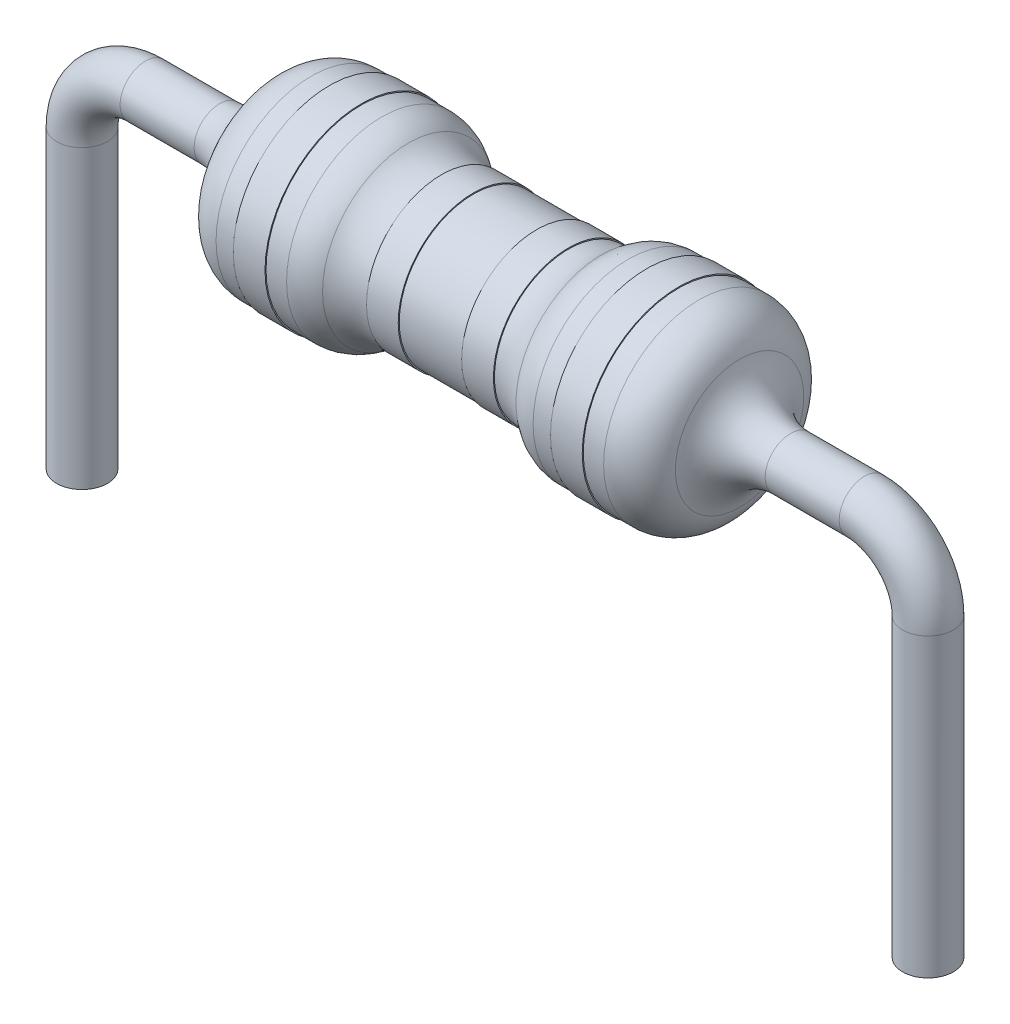
ISO-10303-21;
HEADER;
FILE_DESCRIPTION(('STEP AP214'),'2;1');
FILE_NAME('part.step','',(''),(''),'','','');
FILE_SCHEMA(('AUTOMOTIVE_DESIGN { 1 0 10303 214 1 1 1 1 }'));
ENDSEC;
DATA;
#1=APPLICATION_CONTEXT('core data for automotive mechanical design processes');
#2=APPLICATION_PROTOCOL_DEFINITION('international standard','automotive_design',2000,#1);
#3=PRODUCT_CONTEXT('',#1,'mechanical');
#4=PRODUCT('Part','Part','',(#3));
#5=PRODUCT_RELATED_PRODUCT_CATEGORY('part','',(#4));
#6=PRODUCT_DEFINITION_FORMATION('','',#4);
#7=PRODUCT_DEFINITION_CONTEXT('part definition',#1,'design');
#8=PRODUCT_DEFINITION('design','',#6,#7);
#9=PRODUCT_DEFINITION_SHAPE('','',#8);
#10=(LENGTH_UNIT() NAMED_UNIT(*) SI_UNIT(.MILLI.,.METRE.));
#11=(NAMED_UNIT(*) PLANE_ANGLE_UNIT() SI_UNIT($,.RADIAN.));
#12=(NAMED_UNIT(*) SI_UNIT($,.STERADIAN.) SOLID_ANGLE_UNIT());
#13=UNCERTAINTY_MEASURE_WITH_UNIT(LENGTH_MEASURE(1.E-05),#10,'distance_accuracy_value','');
#14=(GEOMETRIC_REPRESENTATION_CONTEXT(3) GLOBAL_UNCERTAINTY_ASSIGNED_CONTEXT((#13)) GLOBAL_UNIT_ASSIGNED_CONTEXT((#10,
#11,#12)) REPRESENTATION_CONTEXT('',''));
#15=CARTESIAN_POINT('',(0.,0.,0.));
#16=DIRECTION('',(0.,0.,1.));
#17=DIRECTION('',(1.,0.,0.));
#18=AXIS2_PLACEMENT_3D('',#15,#16,#17);
#19=CARTESIAN_POINT('',(0.,-2.54,0.));
#20=DIRECTION('',(0.,1.,0.));
#21=DIRECTION('',(0.,0.,1.));
#22=AXIS2_PLACEMENT_3D('',#19,#20,#21);
#23=PLANE('',#22);
#24=CARTESIAN_POINT('',(0.,-2.54,0.));
#25=DIRECTION('',(0.,-1.,0.));
#26=DIRECTION('',(0.,0.,-1.));
#27=AXIS2_PLACEMENT_3D('',#24,#25,#26);
#28=CIRCLE('',#27,0.3048);
#29=CARTESIAN_POINT('',(0.,-2.54,-0.3048));
#30=VERTEX_POINT('',#29);
#31=EDGE_CURVE('E17',#30,#30,#28,.F.);
#32=ORIENTED_EDGE('',*,*,#31,.F.);
#33=EDGE_LOOP('',(#32));
#34=FACE_BOUND('',#33,.T.);
#35=ADVANCED_FACE('F14',(#34),#23,.F.);
#36=CARTESIAN_POINT('',(0.,1.016,0.));
#37=DIRECTION('',(0.,-1.,0.));
#38=DIRECTION('',(0.,0.,-1.));
#39=AXIS2_PLACEMENT_3D('',#36,#37,#38);
#40=CYLINDRICAL_SURFACE('',#39,0.3048);
#41=CARTESIAN_POINT('',(0.,1.016,0.));
#42=DIRECTION('',(0.,1.,0.));
#43=DIRECTION('',(-1.,0.,0.));
#44=AXIS2_PLACEMENT_3D('',#41,#42,#43);
#45=CIRCLE('',#44,0.3048);
#46=CARTESIAN_POINT('',(-0.3048,1.016,0.));
#47=VERTEX_POINT('',#46);
#48=EDGE_CURVE('E30',#47,#47,#45,.T.);
#49=ORIENTED_EDGE('',*,*,#48,.F.);
#50=EDGE_LOOP('',(#49));
#51=FACE_BOUND('',#50,.T.);
#52=ORIENTED_EDGE('',*,*,#31,.T.);
#53=EDGE_LOOP('',(#52));
#54=FACE_BOUND('',#53,.T.);
#55=ADVANCED_FACE('F115',(#51,#54),#40,.T.);
#56=CARTESIAN_POINT('',(0.762,1.016,0.));
#57=DIRECTION('',(0.,0.,-1.));
#58=DIRECTION('',(-1.,0.,0.));
#59=AXIS2_PLACEMENT_3D('',#56,#57,#58);
#60=TOROIDAL_SURFACE('',#59,0.762,0.3048);
#61=CARTESIAN_POINT('',(0.762,1.778,0.));
#62=DIRECTION('',(1.,0.,0.));
#63=DIRECTION('',(0.,1.,0.));
#64=AXIS2_PLACEMENT_3D('',#61,#62,#63);
#65=CIRCLE('',#64,0.3048);
#66=CARTESIAN_POINT('',(0.762,2.0828,0.));
#67=VERTEX_POINT('',#66);
#68=EDGE_CURVE('E118',#67,#67,#65,.T.);
#69=ORIENTED_EDGE('',*,*,#68,.F.);
#70=EDGE_LOOP('',(#69));
#71=FACE_BOUND('',#70,.T.);
#72=ORIENTED_EDGE('',*,*,#48,.T.);
#73=EDGE_LOOP('',(#72));
#74=FACE_BOUND('',#73,.T.);
#75=ADVANCED_FACE('F112',(#71,#74),#60,.T.);
#76=CARTESIAN_POINT('',(0.762,1.778,0.));
#77=DIRECTION('',(1.,0.,0.));
#78=DIRECTION('',(0.,1.,0.));
#79=AXIS2_PLACEMENT_3D('',#76,#77,#78);
#80=CYLINDRICAL_SURFACE('',#79,0.3048);
#81=ORIENTED_EDGE('',*,*,#68,.T.);
#82=EDGE_LOOP('',(#81));
#83=FACE_BOUND('',#82,.T.);
#84=CARTESIAN_POINT('',(1.651,1.778,0.));
#85=DIRECTION('',(-1.,0.,0.));
#86=DIRECTION('',(0.,0.,1.));
#87=AXIS2_PLACEMENT_3D('',#84,#85,#86);
#88=CIRCLE('',#87,0.3048);
#89=CARTESIAN_POINT('',(1.651,1.778,0.3048));
#90=VERTEX_POINT('',#89);
#91=EDGE_CURVE('E92',#90,#90,#88,.T.);
#92=ORIENTED_EDGE('',*,*,#91,.T.);
#93=EDGE_LOOP('',(#92));
#94=FACE_BOUND('',#93,.T.);
#95=ADVANCED_FACE('F107',(#83,#94),#80,.T.);
#96=CARTESIAN_POINT('',(1.651,1.778,0.));
#97=DIRECTION('',(-1.,0.,0.));
#98=DIRECTION('',(0.,0.,1.));
#99=AXIS2_PLACEMENT_3D('',#96,#97,#98);
#100=TOROIDAL_SURFACE('',#99,0.9398,0.635);
#101=CARTESIAN_POINT('',(2.26300590047991,1.778,0.));
#102=DIRECTION('',(1.,0.,0.));
#103=DIRECTION('',(0.,0.,-1.));
#104=AXIS2_PLACEMENT_3D('',#101,#102,#103);
#105=CIRCLE('',#104,0.77046666666666);
#106=CARTESIAN_POINT('',(2.26300590047991,1.778,-0.77046666666666));
#107=VERTEX_POINT('',#106);
#108=EDGE_CURVE('E87',#107,#107,#105,.T.);
#109=ORIENTED_EDGE('',*,*,#108,.F.);
#110=EDGE_LOOP('',(#109));
#111=FACE_BOUND('',#110,.T.);
#112=ORIENTED_EDGE('',*,*,#91,.F.);
#113=EDGE_LOOP('',(#112));
#114=FACE_BOUND('',#113,.T.);
#115=ADVANCED_FACE('F102',(#111,#114),#100,.F.);
#116=CARTESIAN_POINT('',(2.75261062086383,1.778,0.));
#117=DIRECTION('',(1.,0.,0.));
#118=DIRECTION('',(0.,0.,-1.));
#119=AXIS2_PLACEMENT_3D('',#116,#117,#118);
#120=TOROIDAL_SURFACE('',#119,0.635,0.508);
#121=ORIENTED_EDGE('',*,*,#108,.T.);
#122=EDGE_LOOP('',(#121));
#123=FACE_BOUND('',#122,.T.);
#124=CARTESIAN_POINT('',(2.75261062086383,1.778,0.));
#125=DIRECTION('',(-1.,0.,0.));
#126=DIRECTION('',(0.,0.,1.));
#127=AXIS2_PLACEMENT_3D('',#124,#125,#126);
#128=CIRCLE('',#127,1.143);
#129=CARTESIAN_POINT('',(2.75261062086383,1.778,1.143));
#130=VERTEX_POINT('',#129);
#131=EDGE_CURVE('E83',#130,#130,#128,.F.);
#132=ORIENTED_EDGE('',*,*,#131,.F.);
#133=EDGE_LOOP('',(#132));
#134=FACE_BOUND('',#133,.T.);
#135=ADVANCED_FACE('F106',(#123,#134),#120,.T.);
#136=CARTESIAN_POINT('',(-3.21695881901281,1.778,0.));
#137=DIRECTION('',(-1.,0.,0.));
#138=DIRECTION('',(0.,0.,1.));
#139=AXIS2_PLACEMENT_3D('',#136,#137,#138);
#140=CYLINDRICAL_SURFACE('',#139,1.143);
#141=CARTESIAN_POINT('',(2.9718,1.778,0.));
#142=DIRECTION('',(-1.,0.,0.));
#143=DIRECTION('',(0.,0.,1.));
#144=AXIS2_PLACEMENT_3D('',#141,#142,#143);
#145=CIRCLE('',#144,1.143);
#146=CARTESIAN_POINT('',(2.9718,1.778,1.143));
#147=VERTEX_POINT('',#146);
#148=EDGE_CURVE('E81',#147,#147,#145,.T.);
#149=ORIENTED_EDGE('',*,*,#148,.T.);
#150=EDGE_LOOP('',(#149));
#151=FACE_BOUND('',#150,.T.);
#152=ORIENTED_EDGE('',*,*,#131,.T.);
#153=EDGE_LOOP('',(#152));
#154=FACE_BOUND('',#153,.T.);
#155=ADVANCED_FACE('F236',(#151,#154),#140,.T.);
#156=CARTESIAN_POINT('',(2.9718,1.778,0.));
#157=DIRECTION('',(1.,0.,0.));
#158=DIRECTION('',(0.,0.,-1.));
#159=AXIS2_PLACEMENT_3D('',#156,#157,#158);
#160=PLANE('',#159);
#161=ORIENTED_EDGE('',*,*,#148,.F.);
#162=EDGE_LOOP('',(#161));
#163=FACE_BOUND('',#162,.T.);
#164=CARTESIAN_POINT('',(2.9718,1.778,0.));
#165=DIRECTION('',(-1.,0.,0.));
#166=DIRECTION('',(0.,0.,1.));
#167=AXIS2_PLACEMENT_3D('',#164,#165,#166);
#168=CIRCLE('',#167,1.1557);
#169=CARTESIAN_POINT('',(2.9718,1.778,1.1557));
#170=VERTEX_POINT('',#169);
#171=EDGE_CURVE('E79',#170,#170,#168,.F.);
#172=ORIENTED_EDGE('',*,*,#171,.F.);
#173=EDGE_LOOP('',(#172));
#174=FACE_BOUND('',#173,.T.);
#175=ADVANCED_FACE('F233',(#163,#174),#160,.F.);
#176=CARTESIAN_POINT('',(3.3528,1.778,0.));
#177=DIRECTION('',(-1.,0.,0.));
#178=DIRECTION('',(0.,0.,1.));
#179=AXIS2_PLACEMENT_3D('',#176,#177,#178);
#180=CYLINDRICAL_SURFACE('',#179,1.1557);
#181=ORIENTED_EDGE('',*,*,#171,.T.);
#182=EDGE_LOOP('',(#181));
#183=FACE_BOUND('',#182,.T.);
#184=CARTESIAN_POINT('',(3.3528,1.778,0.));
#185=DIRECTION('',(-1.,0.,0.));
#186=DIRECTION('',(0.,0.,1.));
#187=AXIS2_PLACEMENT_3D('',#184,#185,#186);
#188=CIRCLE('',#187,1.1557);
#189=CARTESIAN_POINT('',(3.3528,1.778,1.1557));
#190=VERTEX_POINT('',#189);
#191=EDGE_CURVE('E76',#190,#190,#188,.F.);
#192=ORIENTED_EDGE('',*,*,#191,.F.);
#193=EDGE_LOOP('',(#192));
#194=FACE_BOUND('',#193,.T.);
#195=ADVANCED_FACE('F229',(#183,#194),#180,.T.);
#196=CARTESIAN_POINT('',(3.3528,1.778,0.));
#197=DIRECTION('',(1.,0.,0.));
#198=DIRECTION('',(0.,0.,-1.));
#199=AXIS2_PLACEMENT_3D('',#196,#197,#198);
#200=PLANE('',#199);
#201=CARTESIAN_POINT('',(3.3528,1.778,0.));
#202=DIRECTION('',(-1.,0.,0.));
#203=DIRECTION('',(0.,0.,1.));
#204=AXIS2_PLACEMENT_3D('',#201,#202,#203);
#205=CIRCLE('',#204,1.143);
#206=CARTESIAN_POINT('',(3.3528,1.778,1.143));
#207=VERTEX_POINT('',#206);
#208=EDGE_CURVE('E72',#207,#207,#205,.F.);
#209=ORIENTED_EDGE('',*,*,#208,.F.);
#210=EDGE_LOOP('',(#209));
#211=FACE_BOUND('',#210,.T.);
#212=ORIENTED_EDGE('',*,*,#191,.T.);
#213=EDGE_LOOP('',(#212));
#214=FACE_BOUND('',#213,.T.);
#215=ADVANCED_FACE('F225',(#211,#214),#200,.T.);
#216=CARTESIAN_POINT('',(-3.21695881901281,1.778,0.));
#217=DIRECTION('',(-1.,0.,0.));
#218=DIRECTION('',(0.,0.,1.));
#219=AXIS2_PLACEMENT_3D('',#216,#217,#218);
#220=CYLINDRICAL_SURFACE('',#219,1.143);
#221=CARTESIAN_POINT('',(3.59957951031447,1.778,0.));
#222=DIRECTION('',(1.,0.,0.));
#223=DIRECTION('',(0.,0.,-1.));
#224=AXIS2_PLACEMENT_3D('',#221,#222,#223);
#225=CIRCLE('',#224,1.143);
#226=CARTESIAN_POINT('',(3.59957951031447,1.778,-1.143));
#227=VERTEX_POINT('',#226);
#228=EDGE_CURVE('E75',#227,#227,#225,.T.);
#229=ORIENTED_EDGE('',*,*,#228,.F.);
#230=EDGE_LOOP('',(#229));
#231=FACE_BOUND('',#230,.T.);
#232=ORIENTED_EDGE('',*,*,#208,.T.);
#233=EDGE_LOOP('',(#232));
#234=FACE_BOUND('',#233,.T.);
#235=ADVANCED_FACE('F221',(#231,#234),#220,.T.);
#236=CARTESIAN_POINT('',(3.59957951031447,1.778,0.));
#237=DIRECTION('',(1.,0.,0.));
#238=DIRECTION('',(0.,0.,-1.));
#239=AXIS2_PLACEMENT_3D('',#236,#237,#238);
#240=TOROIDAL_SURFACE('',#239,0.635,0.508);
#241=ORIENTED_EDGE('',*,*,#228,.T.);
#242=EDGE_LOOP('',(#241));
#243=FACE_BOUND('',#242,.T.);
#244=CARTESIAN_POINT('',(3.91887750573026,1.778,0.));
#245=DIRECTION('',(-1.,0.,0.));
#246=DIRECTION('',(0.,0.,1.));
#247=AXIS2_PLACEMENT_3D('',#244,#245,#246);
#248=CIRCLE('',#247,1.03011111111111);
#249=CARTESIAN_POINT('',(3.91887750573026,1.778,1.03011111111111));
#250=VERTEX_POINT('',#249);
#251=EDGE_CURVE('E71',#250,#250,#248,.T.);
#252=ORIENTED_EDGE('',*,*,#251,.T.);
#253=EDGE_LOOP('',(#252));
#254=FACE_BOUND('',#253,.T.);
#255=ADVANCED_FACE('F216',(#243,#254),#240,.T.);
#256=CARTESIAN_POINT('',(4.318,1.778,0.));
#257=DIRECTION('',(-1.,0.,0.));
#258=DIRECTION('',(0.,0.,1.));
#259=AXIS2_PLACEMENT_3D('',#256,#257,#258);
#260=TOROIDAL_SURFACE('',#259,1.524,0.635);
#261=CARTESIAN_POINT('',(4.318,1.778,0.));
#262=DIRECTION('',(-1.,0.,0.));
#263=DIRECTION('',(0.,0.,1.));
#264=AXIS2_PLACEMENT_3D('',#261,#262,#263);
#265=CIRCLE('',#264,0.889);
#266=CARTESIAN_POINT('',(4.318,1.778,0.889));
#267=VERTEX_POINT('',#266);
#268=EDGE_CURVE('E68',#267,#267,#265,.T.);
#269=ORIENTED_EDGE('',*,*,#268,.T.);
#270=EDGE_LOOP('',(#269));
#271=FACE_BOUND('',#270,.T.);
#272=ORIENTED_EDGE('',*,*,#251,.F.);
#273=EDGE_LOOP('',(#272));
#274=FACE_BOUND('',#273,.T.);
#275=ADVANCED_FACE('F211',(#271,#274),#260,.F.);
#276=CARTESIAN_POINT('',(4.318,1.778,0.));
#277=DIRECTION('',(1.,0.,0.));
#278=DIRECTION('',(0.,0.,-1.));
#279=AXIS2_PLACEMENT_3D('',#276,#277,#278);
#280=PLANE('',#279);
#281=ORIENTED_EDGE('',*,*,#268,.F.);
#282=EDGE_LOOP('',(#281));
#283=FACE_BOUND('',#282,.T.);
#284=CARTESIAN_POINT('',(4.318,1.778,0.));
#285=DIRECTION('',(-1.,0.,0.));
#286=DIRECTION('',(0.,0.,1.));
#287=AXIS2_PLACEMENT_3D('',#284,#285,#286);
#288=CIRCLE('',#287,0.9017);
#289=CARTESIAN_POINT('',(4.318,1.778,0.9017));
#290=VERTEX_POINT('',#289);
#291=EDGE_CURVE('E65',#290,#290,#288,.F.);
#292=ORIENTED_EDGE('',*,*,#291,.F.);
#293=EDGE_LOOP('',(#292));
#294=FACE_BOUND('',#293,.T.);
#295=ADVANCED_FACE('F215',(#283,#294),#280,.F.);
#296=CARTESIAN_POINT('',(4.699,1.778,0.));
#297=DIRECTION('',(-1.,0.,0.));
#298=DIRECTION('',(0.,0.,1.));
#299=AXIS2_PLACEMENT_3D('',#296,#297,#298);
#300=CYLINDRICAL_SURFACE('',#299,0.9017);
#301=ORIENTED_EDGE('',*,*,#291,.T.);
#302=EDGE_LOOP('',(#301));
#303=FACE_BOUND('',#302,.T.);
#304=CARTESIAN_POINT('',(4.699,1.778,0.));
#305=DIRECTION('',(-1.,0.,0.));
#306=DIRECTION('',(0.,0.,1.));
#307=AXIS2_PLACEMENT_3D('',#304,#305,#306);
#308=CIRCLE('',#307,0.9017);
#309=CARTESIAN_POINT('',(4.699,1.778,0.9017));
#310=VERTEX_POINT('',#309);
#311=EDGE_CURVE('E62',#310,#310,#308,.F.);
#312=ORIENTED_EDGE('',*,*,#311,.F.);
#313=EDGE_LOOP('',(#312));
#314=FACE_BOUND('',#313,.T.);
#315=ADVANCED_FACE('F388',(#303,#314),#300,.T.);
#316=CARTESIAN_POINT('',(4.699,1.778,0.));
#317=DIRECTION('',(1.,0.,0.));
#318=DIRECTION('',(0.,0.,-1.));
#319=AXIS2_PLACEMENT_3D('',#316,#317,#318);
#320=PLANE('',#319);
#321=CARTESIAN_POINT('',(4.699,1.778,0.));
#322=DIRECTION('',(-1.,0.,0.));
#323=DIRECTION('',(0.,0.,1.));
#324=AXIS2_PLACEMENT_3D('',#321,#322,#323);
#325=CIRCLE('',#324,0.889);
#326=CARTESIAN_POINT('',(4.699,1.778,0.889));
#327=VERTEX_POINT('',#326);
#328=EDGE_CURVE('E59',#327,#327,#325,.F.);
#329=ORIENTED_EDGE('',*,*,#328,.F.);
#330=EDGE_LOOP('',(#329));
#331=FACE_BOUND('',#330,.T.);
#332=ORIENTED_EDGE('',*,*,#311,.T.);
#333=EDGE_LOOP('',(#332));
#334=FACE_BOUND('',#333,.T.);
#335=ADVANCED_FACE('F397',(#331,#334),#320,.T.);
#336=CARTESIAN_POINT('',(-3.21695881901281,1.778,0.));
#337=DIRECTION('',(-1.,0.,0.));
#338=DIRECTION('',(0.,0.,1.));
#339=AXIS2_PLACEMENT_3D('',#336,#337,#338);
#340=CYLINDRICAL_SURFACE('',#339,0.889);
#341=CARTESIAN_POINT('',(5.461,1.778,0.));
#342=DIRECTION('',(-1.,0.,0.));
#343=DIRECTION('',(0.,0.,1.));
#344=AXIS2_PLACEMENT_3D('',#341,#342,#343);
#345=CIRCLE('',#344,0.889);
#346=CARTESIAN_POINT('',(5.461,1.778,0.889));
#347=VERTEX_POINT('',#346);
#348=EDGE_CURVE('E56',#347,#347,#345,.T.);
#349=ORIENTED_EDGE('',*,*,#348,.T.);
#350=EDGE_LOOP('',(#349));
#351=FACE_BOUND('',#350,.T.);
#352=ORIENTED_EDGE('',*,*,#328,.T.);
#353=EDGE_LOOP('',(#352));
#354=FACE_BOUND('',#353,.T.);
#355=ADVANCED_FACE('F406',(#351,#354),#340,.T.);
#356=CARTESIAN_POINT('',(5.461,1.778,0.));
#357=DIRECTION('',(1.,0.,0.));
#358=DIRECTION('',(0.,0.,-1.));
#359=AXIS2_PLACEMENT_3D('',#356,#357,#358);
#360=PLANE('',#359);
#361=ORIENTED_EDGE('',*,*,#348,.F.);
#362=EDGE_LOOP('',(#361));
#363=FACE_BOUND('',#362,.T.);
#364=CARTESIAN_POINT('',(5.461,1.778,0.));
#365=DIRECTION('',(-1.,0.,0.));
#366=DIRECTION('',(0.,0.,1.));
#367=AXIS2_PLACEMENT_3D('',#364,#365,#366);
#368=CIRCLE('',#367,0.9017);
#369=CARTESIAN_POINT('',(5.461,1.778,0.9017));
#370=VERTEX_POINT('',#369);
#371=EDGE_CURVE('E53',#370,#370,#368,.F.);
#372=ORIENTED_EDGE('',*,*,#371,.F.);
#373=EDGE_LOOP('',(#372));
#374=FACE_BOUND('',#373,.T.);
#375=ADVANCED_FACE('F416',(#363,#374),#360,.F.);
#376=CARTESIAN_POINT('',(5.842,1.778,0.));
#377=DIRECTION('',(-1.,0.,0.));
#378=DIRECTION('',(0.,0.,1.));
#379=AXIS2_PLACEMENT_3D('',#376,#377,#378);
#380=CYLINDRICAL_SURFACE('',#379,0.9017);
#381=ORIENTED_EDGE('',*,*,#371,.T.);
#382=EDGE_LOOP('',(#381));
#383=FACE_BOUND('',#382,.T.);
#384=CARTESIAN_POINT('',(5.842,1.778,0.));
#385=DIRECTION('',(-1.,0.,0.));
#386=DIRECTION('',(0.,0.,1.));
#387=AXIS2_PLACEMENT_3D('',#384,#385,#386);
#388=CIRCLE('',#387,0.9017);
#389=CARTESIAN_POINT('',(5.842,1.778,0.9017));
#390=VERTEX_POINT('',#389);
#391=EDGE_CURVE('E50',#390,#390,#388,.F.);
#392=ORIENTED_EDGE('',*,*,#391,.F.);
#393=EDGE_LOOP('',(#392));
#394=FACE_BOUND('',#393,.T.);
#395=ADVANCED_FACE('F426',(#383,#394),#380,.T.);
#396=CARTESIAN_POINT('',(5.842,1.778,0.));
#397=DIRECTION('',(1.,0.,0.));
#398=DIRECTION('',(0.,0.,-1.));
#399=AXIS2_PLACEMENT_3D('',#396,#397,#398);
#400=PLANE('',#399);
#401=CARTESIAN_POINT('',(5.842,1.778,0.));
#402=DIRECTION('',(1.,0.,0.));
#403=DIRECTION('',(0.,0.,-1.));
#404=AXIS2_PLACEMENT_3D('',#401,#402,#403);
#405=CIRCLE('',#404,0.889);
#406=CARTESIAN_POINT('',(5.842,1.778,-0.889));
#407=VERTEX_POINT('',#406);
#408=EDGE_CURVE('E46',#407,#407,#405,.F.);
#409=ORIENTED_EDGE('',*,*,#408,.T.);
#410=EDGE_LOOP('',(#409));
#411=FACE_BOUND('',#410,.T.);
#412=ORIENTED_EDGE('',*,*,#391,.T.);
#413=EDGE_LOOP('',(#412));
#414=FACE_BOUND('',#413,.T.);
#415=ADVANCED_FACE('F436',(#411,#414),#400,.T.);
#416=CARTESIAN_POINT('',(5.842,1.778,0.));
#417=DIRECTION('',(1.,0.,0.));
#418=DIRECTION('',(0.,0.,-1.));
#419=AXIS2_PLACEMENT_3D('',#416,#417,#418);
#420=TOROIDAL_SURFACE('',#419,1.524,0.635);
#421=ORIENTED_EDGE('',*,*,#408,.F.);
#422=EDGE_LOOP('',(#421));
#423=FACE_BOUND('',#422,.T.);
#424=CARTESIAN_POINT('',(6.24112249426974,1.778,0.));
#425=DIRECTION('',(1.,0.,0.));
#426=DIRECTION('',(0.,0.,-1.));
#427=AXIS2_PLACEMENT_3D('',#424,#425,#426);
#428=CIRCLE('',#427,1.03011111111111);
#429=CARTESIAN_POINT('',(6.24112249426974,1.778,-1.03011111111111));
#430=VERTEX_POINT('',#429);
#431=EDGE_CURVE('E49',#430,#430,#428,.T.);
#432=ORIENTED_EDGE('',*,*,#431,.F.);
#433=EDGE_LOOP('',(#432));
#434=FACE_BOUND('',#433,.T.);
#435=ADVANCED_FACE('F193',(#423,#434),#420,.F.);
#436=CARTESIAN_POINT('',(6.56042048968553,1.778,0.));
#437=DIRECTION('',(1.,0.,0.));
#438=DIRECTION('',(0.,0.,-1.));
#439=AXIS2_PLACEMENT_3D('',#436,#437,#438);
#440=TOROIDAL_SURFACE('',#439,0.635,0.508);
#441=ORIENTED_EDGE('',*,*,#431,.T.);
#442=EDGE_LOOP('',(#441));
#443=FACE_BOUND('',#442,.T.);
#444=CARTESIAN_POINT('',(6.56042048968553,1.778,0.));
#445=DIRECTION('',(-1.,0.,0.));
#446=DIRECTION('',(0.,0.,1.));
#447=AXIS2_PLACEMENT_3D('',#444,#445,#446);
#448=CIRCLE('',#447,1.143);
#449=CARTESIAN_POINT('',(6.56042048968553,1.778,1.143));
#450=VERTEX_POINT('',#449);
#451=EDGE_CURVE('E45',#450,#450,#448,.F.);
#452=ORIENTED_EDGE('',*,*,#451,.F.);
#453=EDGE_LOOP('',(#452));
#454=FACE_BOUND('',#453,.T.);
#455=ADVANCED_FACE('F188',(#443,#454),#440,.T.);
#456=CARTESIAN_POINT('',(-3.21695881901281,1.778,0.));
#457=DIRECTION('',(-1.,0.,0.));
#458=DIRECTION('',(0.,0.,1.));
#459=AXIS2_PLACEMENT_3D('',#456,#457,#458);
#460=CYLINDRICAL_SURFACE('',#459,1.143);
#461=CARTESIAN_POINT('',(6.7818,1.778,0.));
#462=DIRECTION('',(-1.,0.,0.));
#463=DIRECTION('',(0.,0.,1.));
#464=AXIS2_PLACEMENT_3D('',#461,#462,#463);
#465=CIRCLE('',#464,1.143);
#466=CARTESIAN_POINT('',(6.7818,1.778,1.143));
#467=VERTEX_POINT('',#466);
#468=EDGE_CURVE('E42',#467,#467,#465,.T.);
#469=ORIENTED_EDGE('',*,*,#468,.T.);
#470=EDGE_LOOP('',(#469));
#471=FACE_BOUND('',#470,.T.);
#472=ORIENTED_EDGE('',*,*,#451,.T.);
#473=EDGE_LOOP('',(#472));
#474=FACE_BOUND('',#473,.T.);
#475=ADVANCED_FACE('F184',(#471,#474),#460,.T.);
#476=CARTESIAN_POINT('',(6.7818,1.778,0.));
#477=DIRECTION('',(1.,0.,0.));
#478=DIRECTION('',(0.,0.,-1.));
#479=AXIS2_PLACEMENT_3D('',#476,#477,#478);
#480=PLANE('',#479);
#481=ORIENTED_EDGE('',*,*,#468,.F.);
#482=EDGE_LOOP('',(#481));
#483=FACE_BOUND('',#482,.T.);
#484=CARTESIAN_POINT('',(6.7818,1.778,0.));
#485=DIRECTION('',(-1.,0.,0.));
#486=DIRECTION('',(0.,0.,1.));
#487=AXIS2_PLACEMENT_3D('',#484,#485,#486);
#488=CIRCLE('',#487,1.1557);
#489=CARTESIAN_POINT('',(6.7818,1.778,1.1557));
#490=VERTEX_POINT('',#489);
#491=EDGE_CURVE('E39',#490,#490,#488,.F.);
#492=ORIENTED_EDGE('',*,*,#491,.F.);
#493=EDGE_LOOP('',(#492));
#494=FACE_BOUND('',#493,.T.);
#495=ADVANCED_FACE('F180',(#483,#494),#480,.F.);
#496=CARTESIAN_POINT('',(7.1628,1.778,0.));
#497=DIRECTION('',(-1.,0.,0.));
#498=DIRECTION('',(0.,0.,1.));
#499=AXIS2_PLACEMENT_3D('',#496,#497,#498);
#500=CYLINDRICAL_SURFACE('',#499,1.1557);
#501=ORIENTED_EDGE('',*,*,#491,.T.);
#502=EDGE_LOOP('',(#501));
#503=FACE_BOUND('',#502,.T.);
#504=CARTESIAN_POINT('',(7.1628,1.778,0.));
#505=DIRECTION('',(-1.,0.,0.));
#506=DIRECTION('',(0.,0.,1.));
#507=AXIS2_PLACEMENT_3D('',#504,#505,#506);
#508=CIRCLE('',#507,1.1557);
#509=CARTESIAN_POINT('',(7.1628,1.778,1.1557));
#510=VERTEX_POINT('',#509);
#511=EDGE_CURVE('E36',#510,#510,#508,.F.);
#512=ORIENTED_EDGE('',*,*,#511,.F.);
#513=EDGE_LOOP('',(#512));
#514=FACE_BOUND('',#513,.T.);
#515=ADVANCED_FACE('F176',(#503,#514),#500,.T.);
#516=CARTESIAN_POINT('',(7.1628,1.778,0.));
#517=DIRECTION('',(1.,0.,0.));
#518=DIRECTION('',(0.,0.,-1.));
#519=AXIS2_PLACEMENT_3D('',#516,#517,#518);
#520=PLANE('',#519);
#521=CARTESIAN_POINT('',(7.1628,1.778,0.));
#522=DIRECTION('',(-1.,0.,0.));
#523=DIRECTION('',(0.,0.,1.));
#524=AXIS2_PLACEMENT_3D('',#521,#522,#523);
#525=CIRCLE('',#524,1.143);
#526=CARTESIAN_POINT('',(7.1628,1.778,1.143));
#527=VERTEX_POINT('',#526);
#528=EDGE_CURVE('E32',#527,#527,#525,.F.);
#529=ORIENTED_EDGE('',*,*,#528,.F.);
#530=EDGE_LOOP('',(#529));
#531=FACE_BOUND('',#530,.T.);
#532=ORIENTED_EDGE('',*,*,#511,.T.);
#533=EDGE_LOOP('',(#532));
#534=FACE_BOUND('',#533,.T.);
#535=ADVANCED_FACE('F172',(#531,#534),#520,.T.);
#536=CARTESIAN_POINT('',(-3.21695881901281,1.778,0.));
#537=DIRECTION('',(-1.,0.,0.));
#538=DIRECTION('',(0.,0.,1.));
#539=AXIS2_PLACEMENT_3D('',#536,#537,#538);
#540=CYLINDRICAL_SURFACE('',#539,1.143);
#541=ORIENTED_EDGE('',*,*,#528,.T.);
#542=EDGE_LOOP('',(#541));
#543=FACE_BOUND('',#542,.T.);
#544=CARTESIAN_POINT('',(7.40738937913575,1.778,0.));
#545=DIRECTION('',(1.,0.,0.));
#546=DIRECTION('',(0.,0.,-1.));
#547=AXIS2_PLACEMENT_3D('',#544,#545,#546);
#548=CIRCLE('',#547,1.1430000000001);
#549=CARTESIAN_POINT('',(7.40738937913575,1.778,-1.1430000000001));
#550=VERTEX_POINT('',#549);
#551=EDGE_CURVE('E35',#550,#550,#548,.T.);
#552=ORIENTED_EDGE('',*,*,#551,.F.);
#553=EDGE_LOOP('',(#552));
#554=FACE_BOUND('',#553,.T.);
#555=ADVANCED_FACE('F168',(#543,#554),#540,.T.);
#556=CARTESIAN_POINT('',(7.40738937913575,1.778,0.));
#557=DIRECTION('',(1.,0.,0.));
#558=DIRECTION('',(0.,0.,-1.));
#559=AXIS2_PLACEMENT_3D('',#556,#557,#558);
#560=TOROIDAL_SURFACE('',#559,0.635000000000101,0.508);
#561=CARTESIAN_POINT('',(7.89699409952006,1.778,0.));
#562=DIRECTION('',(1.,0.,0.));
#563=DIRECTION('',(0.,0.,-1.));
#564=AXIS2_PLACEMENT_3D('',#561,#562,#563);
#565=CIRCLE('',#564,0.770466666666774);
#566=CARTESIAN_POINT('',(7.89699409952006,1.778,-0.770466666666774));
#567=VERTEX_POINT('',#566);
#568=EDGE_CURVE('E585',#567,#567,#565,.F.);
#569=ORIENTED_EDGE('',*,*,#568,.T.);
#570=EDGE_LOOP('',(#569));
#571=FACE_BOUND('',#570,.T.);
#572=ORIENTED_EDGE('',*,*,#551,.T.);
#573=EDGE_LOOP('',(#572));
#574=FACE_BOUND('',#573,.T.);
#575=ADVANCED_FACE('F164',(#571,#574),#560,.T.);
#576=CARTESIAN_POINT('',(8.509,1.778,0.));
#577=DIRECTION('',(1.,0.,0.));
#578=DIRECTION('',(0.,0.,-1.));
#579=AXIS2_PLACEMENT_3D('',#576,#577,#578);
#580=TOROIDAL_SURFACE('',#579,0.9398,0.635);
#581=CARTESIAN_POINT('',(8.509,1.778,0.));
#582=DIRECTION('',(1.,0.,0.));
#583=DIRECTION('',(0.,1.,0.));
#584=AXIS2_PLACEMENT_3D('',#581,#582,#583);
#585=CIRCLE('',#584,0.3048);
#586=CARTESIAN_POINT('',(8.509,2.0828,0.));
#587=VERTEX_POINT('',#586);
#588=EDGE_CURVE('E156',#587,#587,#585,.T.);
#589=ORIENTED_EDGE('',*,*,#588,.F.);
#590=EDGE_LOOP('',(#589));
#591=FACE_BOUND('',#590,.T.);
#592=ORIENTED_EDGE('',*,*,#568,.F.);
#593=EDGE_LOOP('',(#592));
#594=FACE_BOUND('',#593,.T.);
#595=ADVANCED_FACE('F161',(#591,#594),#580,.F.);
#596=CARTESIAN_POINT('',(0.762,1.778,0.));
#597=DIRECTION('',(1.,0.,0.));
#598=DIRECTION('',(0.,1.,0.));
#599=AXIS2_PLACEMENT_3D('',#596,#597,#598);
#600=CYLINDRICAL_SURFACE('',#599,0.3048);
#601=CARTESIAN_POINT('',(9.398,1.778,0.));
#602=DIRECTION('',(1.,0.,0.));
#603=DIRECTION('',(0.,1.,0.));
#604=AXIS2_PLACEMENT_3D('',#601,#602,#603);
#605=CIRCLE('',#604,0.3048);
#606=CARTESIAN_POINT('',(9.398,2.0828,0.));
#607=VERTEX_POINT('',#606);
#608=EDGE_CURVE('E26',#607,#607,#605,.T.);
#609=ORIENTED_EDGE('',*,*,#608,.F.);
#610=EDGE_LOOP('',(#609));
#611=FACE_BOUND('',#610,.T.);
#612=ORIENTED_EDGE('',*,*,#588,.T.);
#613=EDGE_LOOP('',(#612));
#614=FACE_BOUND('',#613,.T.);
#615=ADVANCED_FACE('F149',(#611,#614),#600,.T.);
#616=CARTESIAN_POINT('',(9.398,1.016,0.));
#617=DIRECTION('',(0.,0.,-1.));
#618=DIRECTION('',(-1.,0.,0.));
#619=AXIS2_PLACEMENT_3D('',#616,#617,#618);
#620=TOROIDAL_SURFACE('',#619,0.762000000000001,0.3048);
#621=ORIENTED_EDGE('',*,*,#608,.T.);
#622=EDGE_LOOP('',(#621));
#623=FACE_BOUND('',#622,.T.);
#624=CARTESIAN_POINT('',(10.16,1.016,0.));
#625=DIRECTION('',(0.,-1.,0.));
#626=DIRECTION('',(0.,0.,-1.));
#627=AXIS2_PLACEMENT_3D('',#624,#625,#626);
#628=CIRCLE('',#627,0.3048);
#629=CARTESIAN_POINT('',(10.16,1.016,-0.3048));
#630=VERTEX_POINT('',#629);
#631=EDGE_CURVE('E21',#630,#630,#628,.T.);
#632=ORIENTED_EDGE('',*,*,#631,.F.);
#633=EDGE_LOOP('',(#632));
#634=FACE_BOUND('',#633,.T.);
#635=ADVANCED_FACE('F141',(#623,#634),#620,.T.);
#636=CARTESIAN_POINT('',(10.16,-2.54,0.));
#637=DIRECTION('',(0.,-1.,0.));
#638=DIRECTION('',(1.,0.,0.));
#639=AXIS2_PLACEMENT_3D('',#636,#637,#638);
#640=PLANE('',#639);
#641=CARTESIAN_POINT('',(10.16,-2.54,0.));
#642=DIRECTION('',(0.,-1.,0.));
#643=DIRECTION('',(0.,0.,-1.));
#644=AXIS2_PLACEMENT_3D('',#641,#642,#643);
#645=CIRCLE('',#644,0.3048);
#646=CARTESIAN_POINT('',(10.16,-2.54,-0.3048));
#647=VERTEX_POINT('',#646);
#648=EDGE_CURVE('E8',#647,#647,#645,.F.);
#649=ORIENTED_EDGE('',*,*,#648,.F.);
#650=EDGE_LOOP('',(#649));
#651=FACE_BOUND('',#650,.T.);
#652=ADVANCED_FACE('F136',(#651),#640,.T.);
#653=CARTESIAN_POINT('',(10.16,1.016,0.));
#654=DIRECTION('',(0.,-1.,0.));
#655=DIRECTION('',(0.,0.,-1.));
#656=AXIS2_PLACEMENT_3D('',#653,#654,#655);
#657=CYLINDRICAL_SURFACE('',#656,0.3048);
#658=ORIENTED_EDGE('',*,*,#648,.T.);
#659=EDGE_LOOP('',(#658));
#660=FACE_BOUND('',#659,.T.);
#661=ORIENTED_EDGE('',*,*,#631,.T.);
#662=EDGE_LOOP('',(#661));
#663=FACE_BOUND('',#662,.T.);
#664=ADVANCED_FACE('F134',(#660,#663),#657,.T.);
#665=CLOSED_SHELL('',(#35,#55,#75,#95,#115,#135,#155,#175,#195,#215,#235,#255,#275,#295,#315,
#335,#355,#375,#395,#415,#435,#455,#475,#495,#515,#535,#555,#575,#595,#615,#635,#652,#664));
#666=MANIFOLD_SOLID_BREP('B1',#665);
#667=ADVANCED_BREP_SHAPE_REPRESENTATION('',(#18,#666),#14);
#668=SHAPE_DEFINITION_REPRESENTATION(#9,#667);
ENDSEC;
END-ISO-10303-21;
